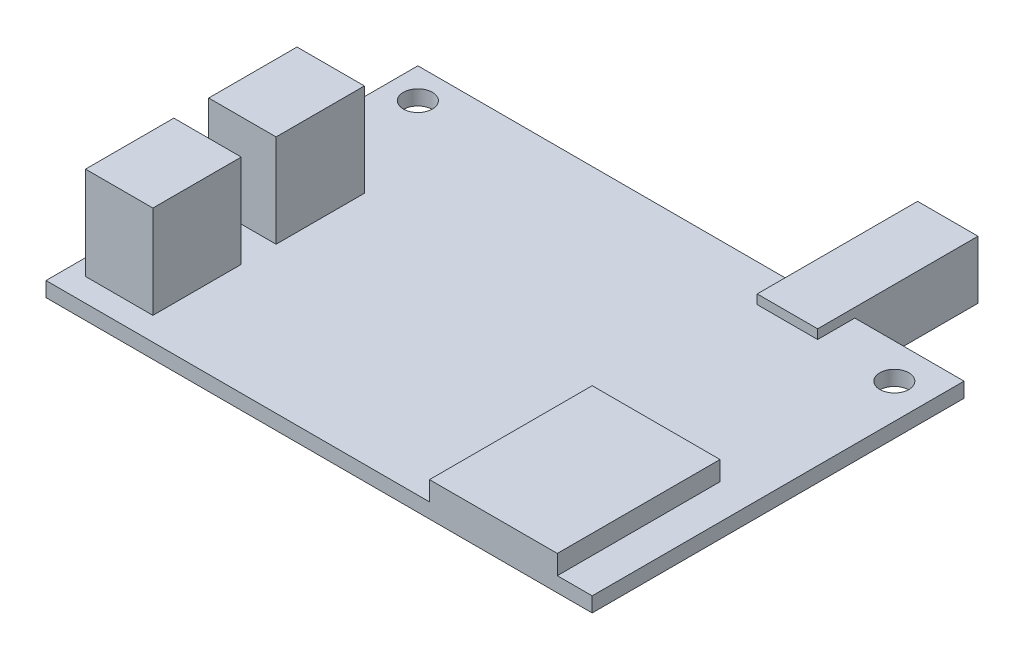
ISO-10303-21;
HEADER;
FILE_DESCRIPTION(('STEP AP214'),'2;1');
FILE_NAME('part.step','',(''),(''),'','','');
FILE_SCHEMA(('AUTOMOTIVE_DESIGN { 1 0 10303 214 1 1 1 1 }'));
ENDSEC;
DATA;
#1=APPLICATION_CONTEXT('core data for automotive mechanical design processes');
#2=APPLICATION_PROTOCOL_DEFINITION('international standard','automotive_design',2000,#1);
#3=PRODUCT_CONTEXT('',#1,'mechanical');
#4=PRODUCT('Part','Part','',(#3));
#5=PRODUCT_RELATED_PRODUCT_CATEGORY('part','',(#4));
#6=PRODUCT_DEFINITION_FORMATION('','',#4);
#7=PRODUCT_DEFINITION_CONTEXT('part definition',#1,'design');
#8=PRODUCT_DEFINITION('design','',#6,#7);
#9=PRODUCT_DEFINITION_SHAPE('','',#8);
#10=(LENGTH_UNIT() NAMED_UNIT(*) SI_UNIT(.MILLI.,.METRE.));
#11=(NAMED_UNIT(*) PLANE_ANGLE_UNIT() SI_UNIT($,.RADIAN.));
#12=(NAMED_UNIT(*) SI_UNIT($,.STERADIAN.) SOLID_ANGLE_UNIT());
#13=UNCERTAINTY_MEASURE_WITH_UNIT(LENGTH_MEASURE(1.E-05),#10,'distance_accuracy_value','');
#14=(GEOMETRIC_REPRESENTATION_CONTEXT(3) GLOBAL_UNCERTAINTY_ASSIGNED_CONTEXT((#13)) GLOBAL_UNIT_ASSIGNED_CONTEXT((#10,
#11,#12)) REPRESENTATION_CONTEXT('',''));
#15=CARTESIAN_POINT('',(0.,0.,0.));
#16=DIRECTION('',(0.,0.,1.));
#17=DIRECTION('',(1.,0.,0.));
#18=AXIS2_PLACEMENT_3D('',#15,#16,#17);
#19=CARTESIAN_POINT('',(0.,1.6256,0.));
#20=DIRECTION('',(0.,-1.,0.));
#21=DIRECTION('',(0.,0.,-1.));
#22=AXIS2_PLACEMENT_3D('',#19,#20,#21);
#23=PLANE('',#22);
#24=DIRECTION('',(0.,0.,1.));
#25=VECTOR('',#24,1.);
#26=CARTESIAN_POINT('',(-28.067,1.6256,17.78));
#27=LINE('',#26,#25);
#28=CARTESIAN_POINT('',(-28.067,1.6256,8.12800000000001));
#29=VERTEX_POINT('',#28);
#30=CARTESIAN_POINT('',(-28.067,1.6256,17.78));
#31=VERTEX_POINT('',#30);
#32=EDGE_CURVE('E214',#29,#31,#27,.T.);
#33=ORIENTED_EDGE('',*,*,#32,.F.);
#34=DIRECTION('',(-1.,0.,0.));
#35=VECTOR('',#34,1.);
#36=CARTESIAN_POINT('',(-28.067,1.6256,8.12800000000001));
#37=LINE('',#36,#35);
#38=CARTESIAN_POINT('',(-20.701,1.6256,8.12800000000001));
#39=VERTEX_POINT('',#38);
#40=EDGE_CURVE('E227',#39,#29,#37,.T.);
#41=ORIENTED_EDGE('',*,*,#40,.F.);
#42=DIRECTION('',(0.,0.,-1.));
#43=VECTOR('',#42,1.);
#44=CARTESIAN_POINT('',(-20.701,1.6256,17.78));
#45=LINE('',#44,#43);
#46=CARTESIAN_POINT('',(-20.701,1.6256,17.78));
#47=VERTEX_POINT('',#46);
#48=EDGE_CURVE('E236',#47,#39,#45,.T.);
#49=ORIENTED_EDGE('',*,*,#48,.F.);
#50=DIRECTION('',(1.,0.,0.));
#51=VECTOR('',#50,1.);
#52=CARTESIAN_POINT('',(-28.067,1.6256,17.78));
#53=LINE('',#52,#51);
#54=EDGE_CURVE('E217',#31,#47,#53,.T.);
#55=ORIENTED_EDGE('',*,*,#54,.F.);
#56=EDGE_LOOP('',(#33,#41,#49,#55));
#57=FACE_BOUND('',#56,.T.);
#58=CARTESIAN_POINT('',(-26.543,1.6256,-17.018));
#59=DIRECTION('',(0.,1.,0.));
#60=DIRECTION('',(0.,0.,1.));
#61=AXIS2_PLACEMENT_3D('',#58,#59,#60);
#62=CIRCLE('',#61,1.5875);
#63=CARTESIAN_POINT('',(-26.543,1.6256,-15.4305));
#64=VERTEX_POINT('',#63);
#65=EDGE_CURVE('E332',#64,#64,#62,.T.);
#66=ORIENTED_EDGE('',*,*,#65,.F.);
#67=EDGE_LOOP('',(#66));
#68=FACE_BOUND('',#67,.T.);
#69=CARTESIAN_POINT('',(26.035,1.6256,-16.51));
#70=DIRECTION('',(0.,1.,0.));
#71=DIRECTION('',(0.,0.,1.));
#72=AXIS2_PLACEMENT_3D('',#69,#70,#71);
#73=CIRCLE('',#72,1.5875);
#74=CARTESIAN_POINT('',(26.035,1.6256,-14.9225));
#75=VERTEX_POINT('',#74);
#76=EDGE_CURVE('E338',#75,#75,#73,.T.);
#77=ORIENTED_EDGE('',*,*,#76,.F.);
#78=EDGE_LOOP('',(#77));
#79=FACE_BOUND('',#78,.T.);
#80=DIRECTION('',(-1.,0.,0.));
#81=VECTOR('',#80,1.);
#82=CARTESIAN_POINT('',(-29.845,1.6256,-20.32));
#83=LINE('',#82,#81);
#84=CARTESIAN_POINT('',(29.845,1.6256,-20.32));
#85=VERTEX_POINT('',#84);
#86=CARTESIAN_POINT('',(17.907,1.6256,-20.32));
#87=VERTEX_POINT('',#86);
#88=EDGE_CURVE('E349',#85,#87,#83,.T.);
#89=ORIENTED_EDGE('',*,*,#88,.T.);
#90=DIRECTION('',(0.,0.,1.));
#91=VECTOR('',#90,1.);
#92=CARTESIAN_POINT('',(17.907,1.6256,0.));
#93=LINE('',#92,#91);
#94=CARTESIAN_POINT('',(17.907,1.6256,-16.256));
#95=VERTEX_POINT('',#94);
#96=EDGE_CURVE('E295',#87,#95,#93,.T.);
#97=ORIENTED_EDGE('',*,*,#96,.T.);
#98=DIRECTION('',(-1.,0.,0.));
#99=VECTOR('',#98,1.);
#100=CARTESIAN_POINT('',(0.,1.6256,-16.256));
#101=LINE('',#100,#99);
#102=CARTESIAN_POINT('',(11.303,1.6256,-16.256));
#103=VERTEX_POINT('',#102);
#104=EDGE_CURVE('E298',#95,#103,#101,.T.);
#105=ORIENTED_EDGE('',*,*,#104,.T.);
#106=DIRECTION('',(0.,0.,-1.));
#107=VECTOR('',#106,1.);
#108=CARTESIAN_POINT('',(11.303,1.6256,0.));
#109=LINE('',#108,#107);
#110=CARTESIAN_POINT('',(11.303,1.6256,-20.32));
#111=VERTEX_POINT('',#110);
#112=EDGE_CURVE('E290',#103,#111,#109,.T.);
#113=ORIENTED_EDGE('',*,*,#112,.T.);
#114=CARTESIAN_POINT('',(-29.845,1.6256,-20.32));
#115=VERTEX_POINT('',#114);
#116=EDGE_CURVE('E347',#111,#115,#83,.T.);
#117=ORIENTED_EDGE('',*,*,#116,.T.);
#118=DIRECTION('',(0.,0.,1.));
#119=VECTOR('',#118,1.);
#120=CARTESIAN_POINT('',(-29.845,1.6256,20.32));
#121=LINE('',#120,#119);
#122=CARTESIAN_POINT('',(-29.845,1.6256,20.32));
#123=VERTEX_POINT('',#122);
#124=EDGE_CURVE('E352',#115,#123,#121,.T.);
#125=ORIENTED_EDGE('',*,*,#124,.T.);
#126=DIRECTION('',(1.,0.,0.));
#127=VECTOR('',#126,1.);
#128=CARTESIAN_POINT('',(-29.845,1.6256,20.32));
#129=LINE('',#128,#127);
#130=CARTESIAN_POINT('',(12.065,1.6256,20.32));
#131=VERTEX_POINT('',#130);
#132=EDGE_CURVE('E355',#123,#131,#129,.T.);
#133=ORIENTED_EDGE('',*,*,#132,.T.);
#134=DIRECTION('',(0.,0.,1.));
#135=VECTOR('',#134,1.);
#136=CARTESIAN_POINT('',(12.065,1.6256,20.32));
#137=LINE('',#136,#135);
#138=CARTESIAN_POINT('',(12.065,1.6256,2.54000000000001));
#139=VERTEX_POINT('',#138);
#140=EDGE_CURVE('E306',#139,#131,#137,.T.);
#141=ORIENTED_EDGE('',*,*,#140,.F.);
#142=DIRECTION('',(-1.,0.,0.));
#143=VECTOR('',#142,1.);
#144=CARTESIAN_POINT('',(26.035,1.6256,2.54000000000001));
#145=LINE('',#144,#143);
#146=CARTESIAN_POINT('',(26.035,1.6256,2.54000000000001));
#147=VERTEX_POINT('',#146);
#148=EDGE_CURVE('E315',#147,#139,#145,.T.);
#149=ORIENTED_EDGE('',*,*,#148,.F.);
#150=DIRECTION('',(0.,0.,-1.));
#151=VECTOR('',#150,1.);
#152=CARTESIAN_POINT('',(26.035,1.6256,20.32));
#153=LINE('',#152,#151);
#154=CARTESIAN_POINT('',(26.035,1.6256,20.32));
#155=VERTEX_POINT('',#154);
#156=EDGE_CURVE('E301',#155,#147,#153,.T.);
#157=ORIENTED_EDGE('',*,*,#156,.F.);
#158=CARTESIAN_POINT('',(29.845,1.6256,20.32));
#159=VERTEX_POINT('',#158);
#160=EDGE_CURVE('E354',#155,#159,#129,.T.);
#161=ORIENTED_EDGE('',*,*,#160,.T.);
#162=DIRECTION('',(0.,0.,-1.));
#163=VECTOR('',#162,1.);
#164=CARTESIAN_POINT('',(29.845,1.6256,20.32));
#165=LINE('',#164,#163);
#166=EDGE_CURVE('E344',#159,#85,#165,.T.);
#167=ORIENTED_EDGE('',*,*,#166,.T.);
#168=EDGE_LOOP('',(#89,#97,#105,#113,#117,#125,#133,#141,#149,#157,#161,#167));
#169=FACE_BOUND('',#168,.T.);
#170=DIRECTION('',(0.,0.,1.));
#171=VECTOR('',#170,1.);
#172=CARTESIAN_POINT('',(-28.067,1.6256,4.31800000000001));
#173=LINE('',#172,#171);
#174=CARTESIAN_POINT('',(-28.067,1.6256,-5.33399999999999));
#175=VERTEX_POINT('',#174);
#176=CARTESIAN_POINT('',(-28.067,1.6256,4.31800000000001));
#177=VERTEX_POINT('',#176);
#178=EDGE_CURVE('E213',#175,#177,#173,.T.);
#179=ORIENTED_EDGE('',*,*,#178,.F.);
#180=DIRECTION('',(-1.,0.,0.));
#181=VECTOR('',#180,1.);
#182=CARTESIAN_POINT('',(-28.067,1.6256,-5.33399999999999));
#183=LINE('',#182,#181);
#184=CARTESIAN_POINT('',(-20.701,1.6256,-5.33399999999999));
#185=VERTEX_POINT('',#184);
#186=EDGE_CURVE('E210',#185,#175,#183,.T.);
#187=ORIENTED_EDGE('',*,*,#186,.F.);
#188=DIRECTION('',(0.,0.,-1.));
#189=VECTOR('',#188,1.);
#190=CARTESIAN_POINT('',(-20.701,1.6256,4.31800000000001));
#191=LINE('',#190,#189);
#192=CARTESIAN_POINT('',(-20.701,1.6256,4.31800000000001));
#193=VERTEX_POINT('',#192);
#194=EDGE_CURVE('E53',#193,#185,#191,.T.);
#195=ORIENTED_EDGE('',*,*,#194,.F.);
#196=DIRECTION('',(1.,0.,0.));
#197=VECTOR('',#196,1.);
#198=CARTESIAN_POINT('',(-28.067,1.6256,4.31800000000001));
#199=LINE('',#198,#197);
#200=EDGE_CURVE('E48',#177,#193,#199,.T.);
#201=ORIENTED_EDGE('',*,*,#200,.F.);
#202=EDGE_LOOP('',(#179,#187,#195,#201));
#203=FACE_BOUND('',#202,.T.);
#204=ADVANCED_FACE('F33',(#57,#68,#79,#169,#203),#23,.F.);
#205=CARTESIAN_POINT('',(-29.845,1.6256,-20.32));
#206=DIRECTION('',(0.,0.,1.));
#207=DIRECTION('',(1.,0.,0.));
#208=AXIS2_PLACEMENT_3D('',#205,#206,#207);
#209=PLANE('',#208);
#210=DIRECTION('',(-1.,0.,0.));
#211=VECTOR('',#210,1.);
#212=CARTESIAN_POINT('',(-29.845,0.,-20.32));
#213=LINE('',#212,#211);
#214=CARTESIAN_POINT('',(29.845,0.,-20.32));
#215=VERTEX_POINT('',#214);
#216=CARTESIAN_POINT('',(17.907,0.,-20.32));
#217=VERTEX_POINT('',#216);
#218=EDGE_CURVE('E361',#215,#217,#213,.T.);
#219=ORIENTED_EDGE('',*,*,#218,.T.);
#220=DIRECTION('',(0.,1.,0.));
#221=VECTOR('',#220,1.);
#222=CARTESIAN_POINT('',(17.907,1.6256,-20.32));
#223=LINE('',#222,#221);
#224=EDGE_CURVE('E41',#217,#87,#223,.T.);
#225=ORIENTED_EDGE('',*,*,#224,.T.);
#226=ORIENTED_EDGE('',*,*,#88,.F.);
#227=DIRECTION('',(0.,-1.,0.));
#228=VECTOR('',#227,1.);
#229=CARTESIAN_POINT('',(29.845,1.6256,-20.32));
#230=LINE('',#229,#228);
#231=EDGE_CURVE('E375',#85,#215,#230,.T.);
#232=ORIENTED_EDGE('',*,*,#231,.T.);
#233=EDGE_LOOP('',(#219,#225,#226,#232));
#234=FACE_BOUND('',#233,.T.);
#235=ADVANCED_FACE('F382',(#234),#209,.F.);
#236=CARTESIAN_POINT('',(0.,0.,0.));
#237=DIRECTION('',(0.,-1.,0.));
#238=DIRECTION('',(0.,0.,-1.));
#239=AXIS2_PLACEMENT_3D('',#236,#237,#238);
#240=PLANE('',#239);
#241=DIRECTION('',(0.,0.,1.));
#242=VECTOR('',#241,1.);
#243=CARTESIAN_POINT('',(17.907,0.,0.));
#244=LINE('',#243,#242);
#245=CARTESIAN_POINT('',(17.907,0.,-16.256));
#246=VERTEX_POINT('',#245);
#247=EDGE_CURVE('E293',#217,#246,#244,.T.);
#248=ORIENTED_EDGE('',*,*,#247,.F.);
#249=ORIENTED_EDGE('',*,*,#218,.F.);
#250=DIRECTION('',(0.,0.,-1.));
#251=VECTOR('',#250,1.);
#252=CARTESIAN_POINT('',(29.845,0.,20.32));
#253=LINE('',#252,#251);
#254=CARTESIAN_POINT('',(29.845,0.,20.32));
#255=VERTEX_POINT('',#254);
#256=EDGE_CURVE('E341',#255,#215,#253,.T.);
#257=ORIENTED_EDGE('',*,*,#256,.F.);
#258=DIRECTION('',(1.,0.,0.));
#259=VECTOR('',#258,1.);
#260=CARTESIAN_POINT('',(-29.845,0.,20.32));
#261=LINE('',#260,#259);
#262=CARTESIAN_POINT('',(-29.845,0.,20.32));
#263=VERTEX_POINT('',#262);
#264=EDGE_CURVE('E348',#263,#255,#261,.T.);
#265=ORIENTED_EDGE('',*,*,#264,.F.);
#266=DIRECTION('',(0.,0.,1.));
#267=VECTOR('',#266,1.);
#268=CARTESIAN_POINT('',(-29.845,0.,20.32));
#269=LINE('',#268,#267);
#270=CARTESIAN_POINT('',(-29.845,0.,-20.32));
#271=VERTEX_POINT('',#270);
#272=EDGE_CURVE('E364',#271,#263,#269,.T.);
#273=ORIENTED_EDGE('',*,*,#272,.F.);
#274=CARTESIAN_POINT('',(11.303,0.,-20.32));
#275=VERTEX_POINT('',#274);
#276=EDGE_CURVE('E360',#275,#271,#213,.T.);
#277=ORIENTED_EDGE('',*,*,#276,.F.);
#278=DIRECTION('',(0.,0.,-1.));
#279=VECTOR('',#278,1.);
#280=CARTESIAN_POINT('',(11.303,0.,0.));
#281=LINE('',#280,#279);
#282=CARTESIAN_POINT('',(11.303,0.,-16.256));
#283=VERTEX_POINT('',#282);
#284=EDGE_CURVE('E280',#283,#275,#281,.T.);
#285=ORIENTED_EDGE('',*,*,#284,.F.);
#286=DIRECTION('',(-1.,0.,0.));
#287=VECTOR('',#286,1.);
#288=CARTESIAN_POINT('',(0.,0.,-16.256));
#289=LINE('',#288,#287);
#290=EDGE_CURVE('E11',#246,#283,#289,.T.);
#291=ORIENTED_EDGE('',*,*,#290,.F.);
#292=EDGE_LOOP('',(#248,#249,#257,#265,#273,#277,#285,#291));
#293=FACE_BOUND('',#292,.T.);
#294=CARTESIAN_POINT('',(26.035,0.,-16.51));
#295=DIRECTION('',(0.,1.,0.));
#296=DIRECTION('',(0.,0.,1.));
#297=AXIS2_PLACEMENT_3D('',#294,#295,#296);
#298=CIRCLE('',#297,1.5875);
#299=CARTESIAN_POINT('',(26.035,0.,-14.9225));
#300=VERTEX_POINT('',#299);
#301=EDGE_CURVE('E335',#300,#300,#298,.T.);
#302=ORIENTED_EDGE('',*,*,#301,.T.);
#303=EDGE_LOOP('',(#302));
#304=FACE_BOUND('',#303,.T.);
#305=CARTESIAN_POINT('',(-26.543,0.,-17.018));
#306=DIRECTION('',(0.,1.,0.));
#307=DIRECTION('',(0.,0.,1.));
#308=AXIS2_PLACEMENT_3D('',#305,#306,#307);
#309=CIRCLE('',#308,1.5875);
#310=CARTESIAN_POINT('',(-26.543,0.,-15.4305));
#311=VERTEX_POINT('',#310);
#312=EDGE_CURVE('E331',#311,#311,#309,.T.);
#313=ORIENTED_EDGE('',*,*,#312,.T.);
#314=EDGE_LOOP('',(#313));
#315=FACE_BOUND('',#314,.T.);
#316=ADVANCED_FACE('F394',(#293,#304,#315),#240,.T.);
#317=CARTESIAN_POINT('',(29.845,1.6256,20.32));
#318=DIRECTION('',(-1.,0.,0.));
#319=DIRECTION('',(0.,0.,1.));
#320=AXIS2_PLACEMENT_3D('',#317,#318,#319);
#321=PLANE('',#320);
#322=ORIENTED_EDGE('',*,*,#256,.T.);
#323=ORIENTED_EDGE('',*,*,#231,.F.);
#324=ORIENTED_EDGE('',*,*,#166,.F.);
#325=DIRECTION('',(0.,-1.,0.));
#326=VECTOR('',#325,1.);
#327=CARTESIAN_POINT('',(29.845,1.6256,20.32));
#328=LINE('',#327,#326);
#329=EDGE_CURVE('E357',#159,#255,#328,.T.);
#330=ORIENTED_EDGE('',*,*,#329,.T.);
#331=EDGE_LOOP('',(#322,#323,#324,#330));
#332=FACE_BOUND('',#331,.T.);
#333=ADVANCED_FACE('F35',(#332),#321,.F.);
#334=ORIENTED_EDGE('',*,*,#116,.F.);
#335=DIRECTION('',(0.,-1.,0.));
#336=VECTOR('',#335,1.);
#337=CARTESIAN_POINT('',(11.303,1.6256,-20.32));
#338=LINE('',#337,#336);
#339=EDGE_CURVE('E378',#111,#275,#338,.T.);
#340=ORIENTED_EDGE('',*,*,#339,.T.);
#341=ORIENTED_EDGE('',*,*,#276,.T.);
#342=DIRECTION('',(0.,-1.,0.));
#343=VECTOR('',#342,1.);
#344=CARTESIAN_POINT('',(-29.845,1.6256,-20.32));
#345=LINE('',#344,#343);
#346=EDGE_CURVE('E372',#115,#271,#345,.T.);
#347=ORIENTED_EDGE('',*,*,#346,.F.);
#348=EDGE_LOOP('',(#334,#340,#341,#347));
#349=FACE_BOUND('',#348,.T.);
#350=ADVANCED_FACE('F424',(#349),#209,.F.);
#351=CARTESIAN_POINT('',(-29.845,1.6256,20.32));
#352=DIRECTION('',(1.,0.,0.));
#353=DIRECTION('',(0.,0.,-1.));
#354=AXIS2_PLACEMENT_3D('',#351,#352,#353);
#355=PLANE('',#354);
#356=ORIENTED_EDGE('',*,*,#272,.T.);
#357=DIRECTION('',(0.,-1.,0.));
#358=VECTOR('',#357,1.);
#359=CARTESIAN_POINT('',(-29.845,1.6256,20.32));
#360=LINE('',#359,#358);
#361=EDGE_CURVE('E369',#123,#263,#360,.T.);
#362=ORIENTED_EDGE('',*,*,#361,.F.);
#363=ORIENTED_EDGE('',*,*,#124,.F.);
#364=ORIENTED_EDGE('',*,*,#346,.T.);
#365=EDGE_LOOP('',(#356,#362,#363,#364));
#366=FACE_BOUND('',#365,.T.);
#367=ADVANCED_FACE('F429',(#366),#355,.F.);
#368=CARTESIAN_POINT('',(-29.845,1.6256,20.32));
#369=DIRECTION('',(0.,0.,-1.));
#370=DIRECTION('',(-1.,0.,0.));
#371=AXIS2_PLACEMENT_3D('',#368,#369,#370);
#372=PLANE('',#371);
#373=ORIENTED_EDGE('',*,*,#264,.T.);
#374=ORIENTED_EDGE('',*,*,#329,.F.);
#375=ORIENTED_EDGE('',*,*,#160,.F.);
#376=DIRECTION('',(0.,-1.,0.));
#377=VECTOR('',#376,1.);
#378=CARTESIAN_POINT('',(26.035,3.7338,20.32));
#379=LINE('',#378,#377);
#380=CARTESIAN_POINT('',(26.035,3.7338,20.32));
#381=VERTEX_POINT('',#380);
#382=EDGE_CURVE('E312',#381,#155,#379,.T.);
#383=ORIENTED_EDGE('',*,*,#382,.F.);
#384=DIRECTION('',(1.,0.,0.));
#385=VECTOR('',#384,1.);
#386=CARTESIAN_POINT('',(26.035,3.7338,20.32));
#387=LINE('',#386,#385);
#388=CARTESIAN_POINT('',(12.065,3.7338,20.32));
#389=VERTEX_POINT('',#388);
#390=EDGE_CURVE('E310',#389,#381,#387,.T.);
#391=ORIENTED_EDGE('',*,*,#390,.F.);
#392=DIRECTION('',(0.,-1.,0.));
#393=VECTOR('',#392,1.);
#394=CARTESIAN_POINT('',(12.065,3.7338,20.32));
#395=LINE('',#394,#393);
#396=EDGE_CURVE('E322',#389,#131,#395,.T.);
#397=ORIENTED_EDGE('',*,*,#396,.T.);
#398=ORIENTED_EDGE('',*,*,#132,.F.);
#399=ORIENTED_EDGE('',*,*,#361,.T.);
#400=EDGE_LOOP('',(#373,#374,#375,#383,#391,#397,#398,#399));
#401=FACE_BOUND('',#400,.T.);
#402=ADVANCED_FACE('F438',(#401),#372,.F.);
#403=CARTESIAN_POINT('',(26.035,1.6256,-16.51));
#404=DIRECTION('',(0.,-1.,0.));
#405=DIRECTION('',(0.,0.,-1.));
#406=AXIS2_PLACEMENT_3D('',#403,#404,#405);
#407=CYLINDRICAL_SURFACE('',#406,1.5875);
#408=ORIENTED_EDGE('',*,*,#76,.T.);
#409=EDGE_LOOP('',(#408));
#410=FACE_BOUND('',#409,.T.);
#411=ORIENTED_EDGE('',*,*,#301,.F.);
#412=EDGE_LOOP('',(#411));
#413=FACE_BOUND('',#412,.T.);
#414=ADVANCED_FACE('F456',(#410,#413),#407,.F.);
#415=CARTESIAN_POINT('',(-26.543,1.6256,-17.018));
#416=DIRECTION('',(0.,-1.,0.));
#417=DIRECTION('',(0.,0.,-1.));
#418=AXIS2_PLACEMENT_3D('',#415,#416,#417);
#419=CYLINDRICAL_SURFACE('',#418,1.5875);
#420=ORIENTED_EDGE('',*,*,#65,.T.);
#421=EDGE_LOOP('',(#420));
#422=FACE_BOUND('',#421,.T.);
#423=ORIENTED_EDGE('',*,*,#312,.F.);
#424=EDGE_LOOP('',(#423));
#425=FACE_BOUND('',#424,.T.);
#426=ADVANCED_FACE('F449',(#422,#425),#419,.F.);
#427=CARTESIAN_POINT('',(26.035,3.7338,20.32));
#428=DIRECTION('',(-1.,0.,0.));
#429=DIRECTION('',(0.,0.,1.));
#430=AXIS2_PLACEMENT_3D('',#427,#428,#429);
#431=PLANE('',#430);
#432=ORIENTED_EDGE('',*,*,#156,.T.);
#433=DIRECTION('',(0.,-1.,0.));
#434=VECTOR('',#433,1.);
#435=CARTESIAN_POINT('',(26.035,3.7338,2.54000000000001));
#436=LINE('',#435,#434);
#437=CARTESIAN_POINT('',(26.035,3.7338,2.54000000000001));
#438=VERTEX_POINT('',#437);
#439=EDGE_CURVE('E328',#438,#147,#436,.T.);
#440=ORIENTED_EDGE('',*,*,#439,.F.);
#441=DIRECTION('',(0.,0.,-1.));
#442=VECTOR('',#441,1.);
#443=CARTESIAN_POINT('',(26.035,3.7338,20.32));
#444=LINE('',#443,#442);
#445=EDGE_CURVE('E302',#381,#438,#444,.T.);
#446=ORIENTED_EDGE('',*,*,#445,.F.);
#447=ORIENTED_EDGE('',*,*,#382,.T.);
#448=EDGE_LOOP('',(#432,#440,#446,#447));
#449=FACE_BOUND('',#448,.T.);
#450=ADVANCED_FACE('F447',(#449),#431,.F.);
#451=CARTESIAN_POINT('',(26.035,3.7338,2.54000000000001));
#452=DIRECTION('',(0.,0.,1.));
#453=DIRECTION('',(1.,0.,0.));
#454=AXIS2_PLACEMENT_3D('',#451,#452,#453);
#455=PLANE('',#454);
#456=ORIENTED_EDGE('',*,*,#148,.T.);
#457=DIRECTION('',(0.,-1.,0.));
#458=VECTOR('',#457,1.);
#459=CARTESIAN_POINT('',(12.065,3.7338,2.54000000000001));
#460=LINE('',#459,#458);
#461=CARTESIAN_POINT('',(12.065,3.7338,2.54000000000001));
#462=VERTEX_POINT('',#461);
#463=EDGE_CURVE('E325',#462,#139,#460,.T.);
#464=ORIENTED_EDGE('',*,*,#463,.F.);
#465=DIRECTION('',(-1.,0.,0.));
#466=VECTOR('',#465,1.);
#467=CARTESIAN_POINT('',(26.035,3.7338,2.54000000000001));
#468=LINE('',#467,#466);
#469=EDGE_CURVE('E305',#438,#462,#468,.T.);
#470=ORIENTED_EDGE('',*,*,#469,.F.);
#471=ORIENTED_EDGE('',*,*,#439,.T.);
#472=EDGE_LOOP('',(#456,#464,#470,#471));
#473=FACE_BOUND('',#472,.T.);
#474=ADVANCED_FACE('F445',(#473),#455,.F.);
#475=CARTESIAN_POINT('',(12.065,3.7338,20.32));
#476=DIRECTION('',(1.,0.,0.));
#477=DIRECTION('',(0.,0.,-1.));
#478=AXIS2_PLACEMENT_3D('',#475,#476,#477);
#479=PLANE('',#478);
#480=ORIENTED_EDGE('',*,*,#140,.T.);
#481=ORIENTED_EDGE('',*,*,#396,.F.);
#482=DIRECTION('',(0.,0.,1.));
#483=VECTOR('',#482,1.);
#484=CARTESIAN_POINT('',(12.065,3.7338,20.32));
#485=LINE('',#484,#483);
#486=EDGE_CURVE('E308',#462,#389,#485,.T.);
#487=ORIENTED_EDGE('',*,*,#486,.F.);
#488=ORIENTED_EDGE('',*,*,#463,.T.);
#489=EDGE_LOOP('',(#480,#481,#487,#488));
#490=FACE_BOUND('',#489,.T.);
#491=ADVANCED_FACE('F434',(#490),#479,.F.);
#492=CARTESIAN_POINT('',(0.,3.7338,0.));
#493=DIRECTION('',(0.,1.,0.));
#494=DIRECTION('',(0.,0.,1.));
#495=AXIS2_PLACEMENT_3D('',#492,#493,#494);
#496=PLANE('',#495);
#497=ORIENTED_EDGE('',*,*,#445,.T.);
#498=ORIENTED_EDGE('',*,*,#469,.T.);
#499=ORIENTED_EDGE('',*,*,#486,.T.);
#500=ORIENTED_EDGE('',*,*,#390,.T.);
#501=EDGE_LOOP('',(#497,#498,#499,#500));
#502=FACE_BOUND('',#501,.T.);
#503=ADVANCED_FACE('F442',(#502),#496,.T.);
#504=CARTESIAN_POINT('',(17.907,-3.7084,-16.256));
#505=DIRECTION('',(0.,0.,1.));
#506=DIRECTION('',(1.,0.,0.));
#507=AXIS2_PLACEMENT_3D('',#504,#505,#506);
#508=PLANE('',#507);
#509=ORIENTED_EDGE('',*,*,#104,.F.);
#510=DIRECTION('',(0.,1.,0.));
#511=VECTOR('',#510,1.);
#512=CARTESIAN_POINT('',(17.907,-3.7084,-16.256));
#513=LINE('',#512,#511);
#514=CARTESIAN_POINT('',(17.907,2.6416,-16.256));
#515=VERTEX_POINT('',#514);
#516=EDGE_CURVE('E281',#95,#515,#513,.T.);
#517=ORIENTED_EDGE('',*,*,#516,.T.);
#518=DIRECTION('',(1.,0.,0.));
#519=VECTOR('',#518,1.);
#520=CARTESIAN_POINT('',(17.907,2.6416,-16.256));
#521=LINE('',#520,#519);
#522=CARTESIAN_POINT('',(11.303,2.6416,-16.256));
#523=VERTEX_POINT('',#522);
#524=EDGE_CURVE('E257',#523,#515,#521,.T.);
#525=ORIENTED_EDGE('',*,*,#524,.F.);
#526=DIRECTION('',(0.,1.,0.));
#527=VECTOR('',#526,1.);
#528=CARTESIAN_POINT('',(11.303,-3.7084,-16.256));
#529=LINE('',#528,#527);
#530=EDGE_CURVE('E285',#103,#523,#529,.T.);
#531=ORIENTED_EDGE('',*,*,#530,.F.);
#532=EDGE_LOOP('',(#509,#517,#525,#531));
#533=FACE_BOUND('',#532,.T.);
#534=ADVANCED_FACE('F419',(#533),#508,.T.);
#535=CARTESIAN_POINT('',(17.907,-3.7084,-16.256));
#536=DIRECTION('',(1.,0.,0.));
#537=DIRECTION('',(0.,0.,-1.));
#538=AXIS2_PLACEMENT_3D('',#535,#536,#537);
#539=PLANE('',#538);
#540=ORIENTED_EDGE('',*,*,#96,.F.);
#541=ORIENTED_EDGE('',*,*,#224,.F.);
#542=ORIENTED_EDGE('',*,*,#247,.T.);
#543=CARTESIAN_POINT('',(17.907,-3.7084,-16.256));
#544=VERTEX_POINT('',#543);
#545=EDGE_CURVE('E277',#544,#246,#513,.T.);
#546=ORIENTED_EDGE('',*,*,#545,.F.);
#547=DIRECTION('',(0.,0.,-1.));
#548=VECTOR('',#547,1.);
#549=CARTESIAN_POINT('',(17.907,-3.7084,-16.256));
#550=LINE('',#549,#548);
#551=CARTESIAN_POINT('',(17.907,-3.7084,-33.782));
#552=VERTEX_POINT('',#551);
#553=EDGE_CURVE('E253',#544,#552,#550,.T.);
#554=ORIENTED_EDGE('',*,*,#553,.T.);
#555=DIRECTION('',(0.,1.,0.));
#556=VECTOR('',#555,1.);
#557=CARTESIAN_POINT('',(17.907,-3.7084,-33.782));
#558=LINE('',#557,#556);
#559=CARTESIAN_POINT('',(17.907,2.6416,-33.782));
#560=VERTEX_POINT('',#559);
#561=EDGE_CURVE('E266',#552,#560,#558,.T.);
#562=ORIENTED_EDGE('',*,*,#561,.T.);
#563=DIRECTION('',(0.,0.,-1.));
#564=VECTOR('',#563,1.);
#565=CARTESIAN_POINT('',(17.907,2.6416,-16.256));
#566=LINE('',#565,#564);
#567=EDGE_CURVE('E252',#515,#560,#566,.T.);
#568=ORIENTED_EDGE('',*,*,#567,.F.);
#569=ORIENTED_EDGE('',*,*,#516,.F.);
#570=EDGE_LOOP('',(#540,#541,#542,#546,#554,#562,#568,#569));
#571=FACE_BOUND('',#570,.T.);
#572=ADVANCED_FACE('F399',(#571),#539,.T.);
#573=CARTESIAN_POINT('',(11.303,-3.7084,-16.256));
#574=DIRECTION('',(-1.,0.,0.));
#575=DIRECTION('',(0.,0.,1.));
#576=AXIS2_PLACEMENT_3D('',#573,#574,#575);
#577=PLANE('',#576);
#578=ORIENTED_EDGE('',*,*,#112,.F.);
#579=ORIENTED_EDGE('',*,*,#530,.T.);
#580=DIRECTION('',(0.,0.,1.));
#581=VECTOR('',#580,1.);
#582=CARTESIAN_POINT('',(11.303,2.6416,-16.256));
#583=LINE('',#582,#581);
#584=CARTESIAN_POINT('',(11.303,2.6416,-33.782));
#585=VERTEX_POINT('',#584);
#586=EDGE_CURVE('E272',#585,#523,#583,.T.);
#587=ORIENTED_EDGE('',*,*,#586,.F.);
#588=DIRECTION('',(0.,1.,0.));
#589=VECTOR('',#588,1.);
#590=CARTESIAN_POINT('',(11.303,-3.7084,-33.782));
#591=LINE('',#590,#589);
#592=CARTESIAN_POINT('',(11.303,-3.7084,-33.782));
#593=VERTEX_POINT('',#592);
#594=EDGE_CURVE('E286',#593,#585,#591,.T.);
#595=ORIENTED_EDGE('',*,*,#594,.F.);
#596=DIRECTION('',(0.,0.,1.));
#597=VECTOR('',#596,1.);
#598=CARTESIAN_POINT('',(11.303,-3.7084,-16.256));
#599=LINE('',#598,#597);
#600=CARTESIAN_POINT('',(11.303,-3.7084,-16.256));
#601=VERTEX_POINT('',#600);
#602=EDGE_CURVE('E260',#593,#601,#599,.T.);
#603=ORIENTED_EDGE('',*,*,#602,.T.);
#604=EDGE_CURVE('E282',#601,#283,#529,.T.);
#605=ORIENTED_EDGE('',*,*,#604,.T.);
#606=ORIENTED_EDGE('',*,*,#284,.T.);
#607=ORIENTED_EDGE('',*,*,#339,.F.);
#608=EDGE_LOOP('',(#578,#579,#587,#595,#603,#605,#606,#607));
#609=FACE_BOUND('',#608,.T.);
#610=ADVANCED_FACE('F567',(#609),#577,.T.);
#611=ORIENTED_EDGE('',*,*,#545,.T.);
#612=ORIENTED_EDGE('',*,*,#290,.T.);
#613=ORIENTED_EDGE('',*,*,#604,.F.);
#614=DIRECTION('',(1.,0.,0.));
#615=VECTOR('',#614,1.);
#616=CARTESIAN_POINT('',(17.907,-3.7084,-16.256));
#617=LINE('',#616,#615);
#618=EDGE_CURVE('E263',#601,#544,#617,.T.);
#619=ORIENTED_EDGE('',*,*,#618,.T.);
#620=EDGE_LOOP('',(#611,#612,#613,#619));
#621=FACE_BOUND('',#620,.T.);
#622=ADVANCED_FACE('F402',(#621),#508,.T.);
#623=CARTESIAN_POINT('',(17.907,-3.7084,-33.782));
#624=DIRECTION('',(0.,0.,-1.));
#625=DIRECTION('',(-1.,0.,0.));
#626=AXIS2_PLACEMENT_3D('',#623,#624,#625);
#627=PLANE('',#626);
#628=DIRECTION('',(-1.,0.,0.));
#629=VECTOR('',#628,1.);
#630=CARTESIAN_POINT('',(17.907,2.6416,-33.782));
#631=LINE('',#630,#629);
#632=EDGE_CURVE('E269',#560,#585,#631,.T.);
#633=ORIENTED_EDGE('',*,*,#632,.F.);
#634=ORIENTED_EDGE('',*,*,#561,.F.);
#635=DIRECTION('',(-1.,0.,0.));
#636=VECTOR('',#635,1.);
#637=CARTESIAN_POINT('',(17.907,-3.7084,-33.782));
#638=LINE('',#637,#636);
#639=EDGE_CURVE('E256',#552,#593,#638,.T.);
#640=ORIENTED_EDGE('',*,*,#639,.T.);
#641=ORIENTED_EDGE('',*,*,#594,.T.);
#642=EDGE_LOOP('',(#633,#634,#640,#641));
#643=FACE_BOUND('',#642,.T.);
#644=ADVANCED_FACE('F412',(#643),#627,.T.);
#645=CARTESIAN_POINT('',(0.,-3.7084,0.));
#646=DIRECTION('',(0.,1.,0.));
#647=DIRECTION('',(0.,0.,1.));
#648=AXIS2_PLACEMENT_3D('',#645,#646,#647);
#649=PLANE('',#648);
#650=ORIENTED_EDGE('',*,*,#553,.F.);
#651=ORIENTED_EDGE('',*,*,#618,.F.);
#652=ORIENTED_EDGE('',*,*,#602,.F.);
#653=ORIENTED_EDGE('',*,*,#639,.F.);
#654=EDGE_LOOP('',(#650,#651,#652,#653));
#655=FACE_BOUND('',#654,.T.);
#656=ADVANCED_FACE('F406',(#655),#649,.F.);
#657=CARTESIAN_POINT('',(0.,2.6416,0.));
#658=DIRECTION('',(0.,1.,0.));
#659=DIRECTION('',(0.,0.,1.));
#660=AXIS2_PLACEMENT_3D('',#657,#658,#659);
#661=PLANE('',#660);
#662=ORIENTED_EDGE('',*,*,#567,.T.);
#663=ORIENTED_EDGE('',*,*,#632,.T.);
#664=ORIENTED_EDGE('',*,*,#586,.T.);
#665=ORIENTED_EDGE('',*,*,#524,.T.);
#666=EDGE_LOOP('',(#662,#663,#664,#665));
#667=FACE_BOUND('',#666,.T.);
#668=ADVANCED_FACE('F415',(#667),#661,.T.);
#669=CARTESIAN_POINT('',(-28.067,11.7856,17.78));
#670=DIRECTION('',(1.,0.,0.));
#671=DIRECTION('',(0.,0.,-1.));
#672=AXIS2_PLACEMENT_3D('',#669,#670,#671);
#673=PLANE('',#672);
#674=ORIENTED_EDGE('',*,*,#32,.T.);
#675=DIRECTION('',(0.,-1.,0.));
#676=VECTOR('',#675,1.);
#677=CARTESIAN_POINT('',(-28.067,11.7856,17.78));
#678=LINE('',#677,#676);
#679=CARTESIAN_POINT('',(-28.067,11.7856,17.78));
#680=VERTEX_POINT('',#679);
#681=EDGE_CURVE('E249',#680,#31,#678,.T.);
#682=ORIENTED_EDGE('',*,*,#681,.F.);
#683=DIRECTION('',(0.,0.,1.));
#684=VECTOR('',#683,1.);
#685=CARTESIAN_POINT('',(-28.067,11.7856,17.78));
#686=LINE('',#685,#684);
#687=CARTESIAN_POINT('',(-28.067,11.7856,8.12800000000001));
#688=VERTEX_POINT('',#687);
#689=EDGE_CURVE('E223',#688,#680,#686,.T.);
#690=ORIENTED_EDGE('',*,*,#689,.F.);
#691=DIRECTION('',(0.,-1.,0.));
#692=VECTOR('',#691,1.);
#693=CARTESIAN_POINT('',(-28.067,11.7856,8.12800000000001));
#694=LINE('',#693,#692);
#695=EDGE_CURVE('E232',#688,#29,#694,.T.);
#696=ORIENTED_EDGE('',*,*,#695,.T.);
#697=EDGE_LOOP('',(#674,#682,#690,#696));
#698=FACE_BOUND('',#697,.T.);
#699=ADVANCED_FACE('F606',(#698),#673,.F.);
#700=CARTESIAN_POINT('',(-28.067,11.7856,17.78));
#701=DIRECTION('',(0.,0.,-1.));
#702=DIRECTION('',(-1.,0.,0.));
#703=AXIS2_PLACEMENT_3D('',#700,#701,#702);
#704=PLANE('',#703);
#705=ORIENTED_EDGE('',*,*,#54,.T.);
#706=DIRECTION('',(0.,-1.,0.));
#707=VECTOR('',#706,1.);
#708=CARTESIAN_POINT('',(-20.701,11.7856,17.78));
#709=LINE('',#708,#707);
#710=CARTESIAN_POINT('',(-20.701,11.7856,17.78));
#711=VERTEX_POINT('',#710);
#712=EDGE_CURVE('E246',#711,#47,#709,.T.);
#713=ORIENTED_EDGE('',*,*,#712,.F.);
#714=DIRECTION('',(1.,0.,0.));
#715=VECTOR('',#714,1.);
#716=CARTESIAN_POINT('',(-28.067,11.7856,17.78));
#717=LINE('',#716,#715);
#718=EDGE_CURVE('E226',#680,#711,#717,.T.);
#719=ORIENTED_EDGE('',*,*,#718,.F.);
#720=ORIENTED_EDGE('',*,*,#681,.T.);
#721=EDGE_LOOP('',(#705,#713,#719,#720));
#722=FACE_BOUND('',#721,.T.);
#723=ADVANCED_FACE('F620',(#722),#704,.F.);
#724=CARTESIAN_POINT('',(-20.701,11.7856,17.78));
#725=DIRECTION('',(-1.,0.,0.));
#726=DIRECTION('',(0.,0.,1.));
#727=AXIS2_PLACEMENT_3D('',#724,#725,#726);
#728=PLANE('',#727);
#729=ORIENTED_EDGE('',*,*,#48,.T.);
#730=DIRECTION('',(0.,-1.,0.));
#731=VECTOR('',#730,1.);
#732=CARTESIAN_POINT('',(-20.701,11.7856,8.12800000000001));
#733=LINE('',#732,#731);
#734=CARTESIAN_POINT('',(-20.701,11.7856,8.12800000000001));
#735=VERTEX_POINT('',#734);
#736=EDGE_CURVE('E243',#735,#39,#733,.T.);
#737=ORIENTED_EDGE('',*,*,#736,.F.);
#738=DIRECTION('',(0.,0.,-1.));
#739=VECTOR('',#738,1.);
#740=CARTESIAN_POINT('',(-20.701,11.7856,17.78));
#741=LINE('',#740,#739);
#742=EDGE_CURVE('E229',#711,#735,#741,.T.);
#743=ORIENTED_EDGE('',*,*,#742,.F.);
#744=ORIENTED_EDGE('',*,*,#712,.T.);
#745=EDGE_LOOP('',(#729,#737,#743,#744));
#746=FACE_BOUND('',#745,.T.);
#747=ADVANCED_FACE('F630',(#746),#728,.F.);
#748=CARTESIAN_POINT('',(-28.067,11.7856,8.12800000000001));
#749=DIRECTION('',(0.,0.,1.));
#750=DIRECTION('',(1.,0.,0.));
#751=AXIS2_PLACEMENT_3D('',#748,#749,#750);
#752=PLANE('',#751);
#753=ORIENTED_EDGE('',*,*,#40,.T.);
#754=ORIENTED_EDGE('',*,*,#695,.F.);
#755=DIRECTION('',(-1.,0.,0.));
#756=VECTOR('',#755,1.);
#757=CARTESIAN_POINT('',(-28.067,11.7856,8.12800000000001));
#758=LINE('',#757,#756);
#759=EDGE_CURVE('E231',#735,#688,#758,.T.);
#760=ORIENTED_EDGE('',*,*,#759,.F.);
#761=ORIENTED_EDGE('',*,*,#736,.T.);
#762=EDGE_LOOP('',(#753,#754,#760,#761));
#763=FACE_BOUND('',#762,.T.);
#764=ADVANCED_FACE('F640',(#763),#752,.F.);
#765=CARTESIAN_POINT('',(0.,11.7856,0.));
#766=DIRECTION('',(0.,-1.,0.));
#767=DIRECTION('',(0.,0.,-1.));
#768=AXIS2_PLACEMENT_3D('',#765,#766,#767);
#769=PLANE('',#768);
#770=ORIENTED_EDGE('',*,*,#689,.T.);
#771=ORIENTED_EDGE('',*,*,#718,.T.);
#772=ORIENTED_EDGE('',*,*,#742,.T.);
#773=ORIENTED_EDGE('',*,*,#759,.T.);
#774=EDGE_LOOP('',(#770,#771,#772,#773));
#775=FACE_BOUND('',#774,.T.);
#776=ADVANCED_FACE('F650',(#775),#769,.F.);
#777=CARTESIAN_POINT('',(-28.067,11.7856,4.31800000000001));
#778=DIRECTION('',(1.,0.,0.));
#779=DIRECTION('',(0.,0.,-1.));
#780=AXIS2_PLACEMENT_3D('',#777,#778,#779);
#781=PLANE('',#780);
#782=ORIENTED_EDGE('',*,*,#178,.T.);
#783=DIRECTION('',(0.,-1.,0.));
#784=VECTOR('',#783,1.);
#785=CARTESIAN_POINT('',(-28.067,11.7856,4.31800000000001));
#786=LINE('',#785,#784);
#787=CARTESIAN_POINT('',(-28.067,11.7856,4.31800000000001));
#788=VERTEX_POINT('',#787);
#789=EDGE_CURVE('E194',#788,#177,#786,.T.);
#790=ORIENTED_EDGE('',*,*,#789,.F.);
#791=DIRECTION('',(0.,0.,1.));
#792=VECTOR('',#791,1.);
#793=CARTESIAN_POINT('',(-28.067,11.7856,4.31800000000001));
#794=LINE('',#793,#792);
#795=CARTESIAN_POINT('',(-28.067,11.7856,-5.33399999999999));
#796=VERTEX_POINT('',#795);
#797=EDGE_CURVE('E201',#796,#788,#794,.T.);
#798=ORIENTED_EDGE('',*,*,#797,.F.);
#799=DIRECTION('',(0.,-1.,0.));
#800=VECTOR('',#799,1.);
#801=CARTESIAN_POINT('',(-28.067,11.7856,-5.33399999999999));
#802=LINE('',#801,#800);
#803=EDGE_CURVE('E710',#796,#175,#802,.T.);
#804=ORIENTED_EDGE('',*,*,#803,.T.);
#805=EDGE_LOOP('',(#782,#790,#798,#804));
#806=FACE_BOUND('',#805,.T.);
#807=ADVANCED_FACE('F212',(#806),#781,.F.);
#808=CARTESIAN_POINT('',(-28.067,11.7856,4.31800000000001));
#809=DIRECTION('',(0.,0.,-1.));
#810=DIRECTION('',(-1.,0.,0.));
#811=AXIS2_PLACEMENT_3D('',#808,#809,#810);
#812=PLANE('',#811);
#813=ORIENTED_EDGE('',*,*,#200,.T.);
#814=DIRECTION('',(0.,-1.,0.));
#815=VECTOR('',#814,1.);
#816=CARTESIAN_POINT('',(-20.701,11.7856,4.31800000000001));
#817=LINE('',#816,#815);
#818=CARTESIAN_POINT('',(-20.701,11.7856,4.31800000000001));
#819=VERTEX_POINT('',#818);
#820=EDGE_CURVE('E197',#819,#193,#817,.T.);
#821=ORIENTED_EDGE('',*,*,#820,.F.);
#822=DIRECTION('',(1.,0.,0.));
#823=VECTOR('',#822,1.);
#824=CARTESIAN_POINT('',(-28.067,11.7856,4.31800000000001));
#825=LINE('',#824,#823);
#826=EDGE_CURVE('E190',#788,#819,#825,.T.);
#827=ORIENTED_EDGE('',*,*,#826,.F.);
#828=ORIENTED_EDGE('',*,*,#789,.T.);
#829=EDGE_LOOP('',(#813,#821,#827,#828));
#830=FACE_BOUND('',#829,.T.);
#831=ADVANCED_FACE('F192',(#830),#812,.F.);
#832=CARTESIAN_POINT('',(-20.701,11.7856,4.31800000000001));
#833=DIRECTION('',(-1.,0.,0.));
#834=DIRECTION('',(0.,0.,1.));
#835=AXIS2_PLACEMENT_3D('',#832,#833,#834);
#836=PLANE('',#835);
#837=ORIENTED_EDGE('',*,*,#194,.T.);
#838=DIRECTION('',(0.,-1.,0.));
#839=VECTOR('',#838,1.);
#840=CARTESIAN_POINT('',(-20.701,11.7856,-5.33399999999999));
#841=LINE('',#840,#839);
#842=CARTESIAN_POINT('',(-20.701,11.7856,-5.33399999999999));
#843=VERTEX_POINT('',#842);
#844=EDGE_CURVE('E219',#843,#185,#841,.T.);
#845=ORIENTED_EDGE('',*,*,#844,.F.);
#846=DIRECTION('',(0.,0.,-1.));
#847=VECTOR('',#846,1.);
#848=CARTESIAN_POINT('',(-20.701,11.7856,4.31800000000001));
#849=LINE('',#848,#847);
#850=EDGE_CURVE('E200',#819,#843,#849,.T.);
#851=ORIENTED_EDGE('',*,*,#850,.F.);
#852=ORIENTED_EDGE('',*,*,#820,.T.);
#853=EDGE_LOOP('',(#837,#845,#851,#852));
#854=FACE_BOUND('',#853,.T.);
#855=ADVANCED_FACE('F677',(#854),#836,.F.);
#856=CARTESIAN_POINT('',(-28.067,11.7856,-5.33399999999999));
#857=DIRECTION('',(0.,0.,1.));
#858=DIRECTION('',(1.,0.,0.));
#859=AXIS2_PLACEMENT_3D('',#856,#857,#858);
#860=PLANE('',#859);
#861=ORIENTED_EDGE('',*,*,#186,.T.);
#862=ORIENTED_EDGE('',*,*,#803,.F.);
#863=DIRECTION('',(-1.,0.,0.));
#864=VECTOR('',#863,1.);
#865=CARTESIAN_POINT('',(-28.067,11.7856,-5.33399999999999));
#866=LINE('',#865,#864);
#867=EDGE_CURVE('E206',#843,#796,#866,.T.);
#868=ORIENTED_EDGE('',*,*,#867,.F.);
#869=ORIENTED_EDGE('',*,*,#844,.T.);
#870=EDGE_LOOP('',(#861,#862,#868,#869));
#871=FACE_BOUND('',#870,.T.);
#872=ADVANCED_FACE('F686',(#871),#860,.F.);
#873=CARTESIAN_POINT('',(0.,11.7856,0.));
#874=DIRECTION('',(0.,-1.,0.));
#875=DIRECTION('',(0.,0.,-1.));
#876=AXIS2_PLACEMENT_3D('',#873,#874,#875);
#877=PLANE('',#876);
#878=ORIENTED_EDGE('',*,*,#797,.T.);
#879=ORIENTED_EDGE('',*,*,#826,.T.);
#880=ORIENTED_EDGE('',*,*,#850,.T.);
#881=ORIENTED_EDGE('',*,*,#867,.T.);
#882=EDGE_LOOP('',(#878,#879,#880,#881));
#883=FACE_BOUND('',#882,.T.);
#884=ADVANCED_FACE('F204',(#883),#877,.F.);
#885=CLOSED_SHELL('',(#204,#235,#316,#333,#350,#367,#402,#414,#426,#450,#474,#491,#503,#534,
#572,#610,#622,#644,#656,#668,#699,#723,#747,#764,#776,#807,#831,#855,#872,#884));
#886=MANIFOLD_SOLID_BREP('B2',#885);
#887=ADVANCED_BREP_SHAPE_REPRESENTATION('',(#18,#886),#14);
#888=SHAPE_DEFINITION_REPRESENTATION(#9,#887);
ENDSEC;
END-ISO-10303-21;
